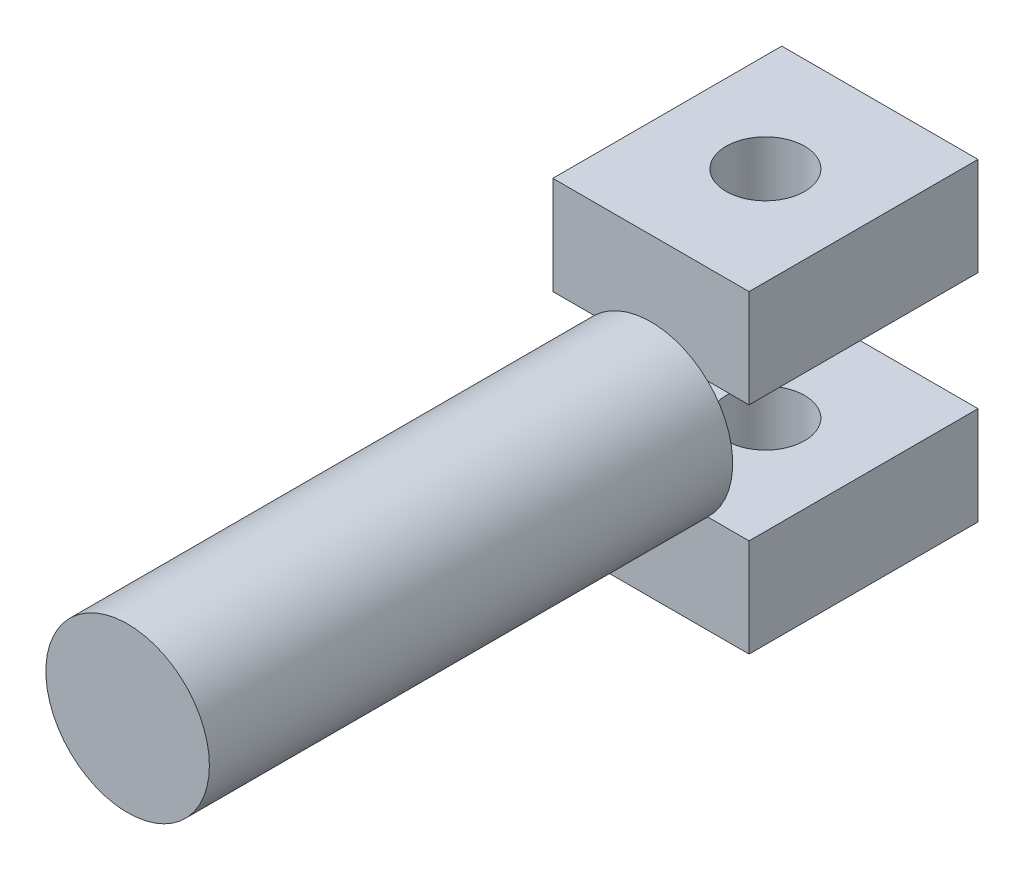
ISO-10303-21;
HEADER;
FILE_DESCRIPTION(('STEP AP214'),'2;1');
FILE_NAME('part.step','',(''),(''),'','','');
FILE_SCHEMA(('AUTOMOTIVE_DESIGN { 1 0 10303 214 1 1 1 1 }'));
ENDSEC;
DATA;
#1=APPLICATION_CONTEXT('core data for automotive mechanical design processes');
#2=APPLICATION_PROTOCOL_DEFINITION('international standard','automotive_design',2000,#1);
#3=PRODUCT_CONTEXT('',#1,'mechanical');
#4=PRODUCT('Part','Part','',(#3));
#5=PRODUCT_RELATED_PRODUCT_CATEGORY('part','',(#4));
#6=PRODUCT_DEFINITION_FORMATION('','',#4);
#7=PRODUCT_DEFINITION_CONTEXT('part definition',#1,'design');
#8=PRODUCT_DEFINITION('design','',#6,#7);
#9=PRODUCT_DEFINITION_SHAPE('','',#8);
#10=(LENGTH_UNIT() NAMED_UNIT(*) SI_UNIT(.MILLI.,.METRE.));
#11=(NAMED_UNIT(*) PLANE_ANGLE_UNIT() SI_UNIT($,.RADIAN.));
#12=(NAMED_UNIT(*) SI_UNIT($,.STERADIAN.) SOLID_ANGLE_UNIT());
#13=UNCERTAINTY_MEASURE_WITH_UNIT(LENGTH_MEASURE(1.E-05),#10,'distance_accuracy_value','');
#14=(GEOMETRIC_REPRESENTATION_CONTEXT(3) GLOBAL_UNCERTAINTY_ASSIGNED_CONTEXT((#13)) GLOBAL_UNIT_ASSIGNED_CONTEXT((#10,
#11,#12)) REPRESENTATION_CONTEXT('',''));
#15=CARTESIAN_POINT('',(0.,0.,0.));
#16=DIRECTION('',(0.,0.,1.));
#17=DIRECTION('',(1.,0.,0.));
#18=AXIS2_PLACEMENT_3D('',#15,#16,#17);
#19=CARTESIAN_POINT('',(-15.,-24.,-35.));
#20=DIRECTION('',(0.,1.,0.));
#21=DIRECTION('',(0.,0.,1.));
#22=AXIS2_PLACEMENT_3D('',#19,#20,#21);
#23=PLANE('',#22);
#24=DIRECTION('',(1.,0.,0.));
#25=VECTOR('',#24,1.);
#26=CARTESIAN_POINT('',(-15.,-24.,-35.));
#27=LINE('',#26,#25);
#28=CARTESIAN_POINT('',(-15.,-24.,-35.));
#29=VERTEX_POINT('',#28);
#30=CARTESIAN_POINT('',(15.,-24.,-35.));
#31=VERTEX_POINT('',#30);
#32=EDGE_CURVE('E281',#29,#31,#27,.T.);
#33=ORIENTED_EDGE('',*,*,#32,.T.);
#34=DIRECTION('',(0.,0.,1.));
#35=VECTOR('',#34,1.);
#36=CARTESIAN_POINT('',(15.,-24.,-35.));
#37=LINE('',#36,#35);
#38=CARTESIAN_POINT('',(15.,-24.,0.));
#39=VERTEX_POINT('',#38);
#40=EDGE_CURVE('E138',#31,#39,#37,.T.);
#41=ORIENTED_EDGE('',*,*,#40,.T.);
#42=DIRECTION('',(1.,0.,0.));
#43=VECTOR('',#42,1.);
#44=CARTESIAN_POINT('',(-15.,-24.,0.));
#45=LINE('',#44,#43);
#46=CARTESIAN_POINT('',(-15.,-24.,0.));
#47=VERTEX_POINT('',#46);
#48=EDGE_CURVE('E130',#47,#39,#45,.T.);
#49=ORIENTED_EDGE('',*,*,#48,.F.);
#50=DIRECTION('',(0.,0.,1.));
#51=VECTOR('',#50,1.);
#52=CARTESIAN_POINT('',(-15.,-24.,-35.));
#53=LINE('',#52,#51);
#54=EDGE_CURVE('E122',#29,#47,#53,.T.);
#55=ORIENTED_EDGE('',*,*,#54,.F.);
#56=EDGE_LOOP('',(#33,#41,#49,#55));
#57=FACE_BOUND('',#56,.T.);
#58=CARTESIAN_POINT('',(0.,-24.000012,-17.5));
#59=DIRECTION('',(0.,-1.,0.));
#60=DIRECTION('',(0.,0.,-1.));
#61=AXIS2_PLACEMENT_3D('',#58,#59,#60);
#62=CIRCLE('',#61,6.);
#63=CARTESIAN_POINT('',(0.,-24.000012,-23.5));
#64=VERTEX_POINT('',#63);
#65=EDGE_CURVE('E150',#64,#64,#62,.T.);
#66=ORIENTED_EDGE('',*,*,#65,.F.);
#67=EDGE_LOOP('',(#66));
#68=FACE_BOUND('',#67,.T.);
#69=ADVANCED_FACE('F44',(#57,#68),#23,.F.);
#70=CARTESIAN_POINT('',(-15.,-24.,0.));
#71=DIRECTION('',(0.,0.,-1.));
#72=DIRECTION('',(-1.,0.,0.));
#73=AXIS2_PLACEMENT_3D('',#70,#71,#72);
#74=PLANE('',#73);
#75=DIRECTION('',(-1.,0.,0.));
#76=VECTOR('',#75,1.);
#77=CARTESIAN_POINT('',(15.,8.99999999999999,0.));
#78=LINE('',#77,#76);
#79=CARTESIAN_POINT('',(15.,8.99999999999999,0.));
#80=VERTEX_POINT('',#79);
#81=CARTESIAN_POINT('',(8.67467578644874,8.99999999999999,0.));
#82=VERTEX_POINT('',#81);
#83=EDGE_CURVE('E111',#80,#82,#78,.T.);
#84=ORIENTED_EDGE('',*,*,#83,.F.);
#85=DIRECTION('',(0.,1.,0.));
#86=VECTOR('',#85,1.);
#87=CARTESIAN_POINT('',(15.,-24.,0.));
#88=LINE('',#87,#86);
#89=CARTESIAN_POINT('',(15.,24.,0.));
#90=VERTEX_POINT('',#89);
#91=EDGE_CURVE('E239',#80,#90,#88,.T.);
#92=ORIENTED_EDGE('',*,*,#91,.T.);
#93=DIRECTION('',(1.,0.,0.));
#94=VECTOR('',#93,1.);
#95=CARTESIAN_POINT('',(-15.,24.,0.));
#96=LINE('',#95,#94);
#97=CARTESIAN_POINT('',(-15.,24.,0.));
#98=VERTEX_POINT('',#97);
#99=EDGE_CURVE('E233',#98,#90,#96,.T.);
#100=ORIENTED_EDGE('',*,*,#99,.F.);
#101=DIRECTION('',(0.,1.,0.));
#102=VECTOR('',#101,1.);
#103=CARTESIAN_POINT('',(-15.,0.,0.));
#104=LINE('',#103,#102);
#105=CARTESIAN_POINT('',(-15.,8.99999999999999,0.));
#106=VERTEX_POINT('',#105);
#107=EDGE_CURVE('E136',#106,#98,#104,.T.);
#108=ORIENTED_EDGE('',*,*,#107,.F.);
#109=CARTESIAN_POINT('',(-8.67467578644874,8.99999999999999,0.));
#110=VERTEX_POINT('',#109);
#111=EDGE_CURVE('E87',#110,#106,#78,.T.);
#112=ORIENTED_EDGE('',*,*,#111,.F.);
#113=CARTESIAN_POINT('',(0.,0.,0.));
#114=DIRECTION('',(0.,0.,1.));
#115=DIRECTION('',(1.,0.,0.));
#116=AXIS2_PLACEMENT_3D('',#113,#114,#115);
#117=CIRCLE('',#116,12.5);
#118=EDGE_CURVE('E59',#82,#110,#117,.T.);
#119=ORIENTED_EDGE('',*,*,#118,.F.);
#120=EDGE_LOOP('',(#84,#92,#100,#108,#112,#119));
#121=FACE_BOUND('',#120,.T.);
#122=ADVANCED_FACE('F193',(#121),#74,.F.);
#123=CARTESIAN_POINT('',(-15.,-24.,-35.));
#124=DIRECTION('',(0.,0.,1.));
#125=DIRECTION('',(1.,0.,0.));
#126=AXIS2_PLACEMENT_3D('',#123,#124,#125);
#127=PLANE('',#126);
#128=DIRECTION('',(-1.,0.,0.));
#129=VECTOR('',#128,1.);
#130=CARTESIAN_POINT('',(15.,-9.,-35.));
#131=LINE('',#130,#129);
#132=CARTESIAN_POINT('',(15.,-9.,-35.));
#133=VERTEX_POINT('',#132);
#134=CARTESIAN_POINT('',(-15.,-9.,-35.));
#135=VERTEX_POINT('',#134);
#136=EDGE_CURVE('E67',#133,#135,#131,.T.);
#137=ORIENTED_EDGE('',*,*,#136,.F.);
#138=DIRECTION('',(0.,-1.,0.));
#139=VECTOR('',#138,1.);
#140=CARTESIAN_POINT('',(15.,-24.,-35.));
#141=LINE('',#140,#139);
#142=EDGE_CURVE('E269',#133,#31,#141,.T.);
#143=ORIENTED_EDGE('',*,*,#142,.T.);
#144=ORIENTED_EDGE('',*,*,#32,.F.);
#145=DIRECTION('',(0.,1.,0.));
#146=VECTOR('',#145,1.);
#147=CARTESIAN_POINT('',(-15.,0.,-35.));
#148=LINE('',#147,#146);
#149=EDGE_CURVE('E124',#135,#29,#148,.F.);
#150=ORIENTED_EDGE('',*,*,#149,.F.);
#151=EDGE_LOOP('',(#137,#143,#144,#150));
#152=FACE_BOUND('',#151,.T.);
#153=ADVANCED_FACE('F188',(#152),#127,.F.);
#154=CARTESIAN_POINT('',(-15.,0.,0.));
#155=DIRECTION('',(1.,0.,0.));
#156=DIRECTION('',(0.,0.,-1.));
#157=AXIS2_PLACEMENT_3D('',#154,#155,#156);
#158=PLANE('',#157);
#159=DIRECTION('',(0.,0.,-1.));
#160=VECTOR('',#159,1.);
#161=CARTESIAN_POINT('',(-15.,8.99999999999999,0.));
#162=LINE('',#161,#160);
#163=CARTESIAN_POINT('',(-15.,9.,-35.));
#164=VERTEX_POINT('',#163);
#165=EDGE_CURVE('E89',#106,#164,#162,.T.);
#166=ORIENTED_EDGE('',*,*,#165,.F.);
#167=ORIENTED_EDGE('',*,*,#107,.T.);
#168=DIRECTION('',(0.,0.,-1.));
#169=VECTOR('',#168,1.);
#170=CARTESIAN_POINT('',(-15.,24.,-35.));
#171=LINE('',#170,#169);
#172=CARTESIAN_POINT('',(-15.,24.,-35.));
#173=VERTEX_POINT('',#172);
#174=EDGE_CURVE('E116',#98,#173,#171,.T.);
#175=ORIENTED_EDGE('',*,*,#174,.T.);
#176=DIRECTION('',(0.,1.,0.));
#177=VECTOR('',#176,1.);
#178=CARTESIAN_POINT('',(-15.,0.,-35.));
#179=LINE('',#178,#177);
#180=EDGE_CURVE('E109',#173,#164,#179,.F.);
#181=ORIENTED_EDGE('',*,*,#180,.T.);
#182=EDGE_LOOP('',(#166,#167,#175,#181));
#183=FACE_BOUND('',#182,.T.);
#184=ADVANCED_FACE('F120',(#183),#158,.F.);
#185=DIRECTION('',(0.,0.,1.));
#186=VECTOR('',#185,1.);
#187=CARTESIAN_POINT('',(-15.,-8.99999999999999,0.));
#188=LINE('',#187,#186);
#189=CARTESIAN_POINT('',(-15.,-8.99999999999999,0.));
#190=VERTEX_POINT('',#189);
#191=EDGE_CURVE('E105',#135,#190,#188,.T.);
#192=ORIENTED_EDGE('',*,*,#191,.F.);
#193=ORIENTED_EDGE('',*,*,#149,.T.);
#194=ORIENTED_EDGE('',*,*,#54,.T.);
#195=DIRECTION('',(0.,1.,0.));
#196=VECTOR('',#195,1.);
#197=CARTESIAN_POINT('',(-15.,0.,0.));
#198=LINE('',#197,#196);
#199=EDGE_CURVE('E135',#47,#190,#198,.T.);
#200=ORIENTED_EDGE('',*,*,#199,.T.);
#201=EDGE_LOOP('',(#192,#193,#194,#200));
#202=FACE_BOUND('',#201,.T.);
#203=ADVANCED_FACE('F190',(#202),#158,.F.);
#204=CARTESIAN_POINT('',(15.,0.,0.));
#205=DIRECTION('',(1.,0.,0.));
#206=DIRECTION('',(0.,0.,-1.));
#207=AXIS2_PLACEMENT_3D('',#204,#205,#206);
#208=PLANE('',#207);
#209=ORIENTED_EDGE('',*,*,#142,.F.);
#210=DIRECTION('',(0.,0.,1.));
#211=VECTOR('',#210,1.);
#212=CARTESIAN_POINT('',(15.,-8.99999999999999,0.));
#213=LINE('',#212,#211);
#214=CARTESIAN_POINT('',(15.,-8.99999999999999,0.));
#215=VERTEX_POINT('',#214);
#216=EDGE_CURVE('E252',#133,#215,#213,.T.);
#217=ORIENTED_EDGE('',*,*,#216,.T.);
#218=EDGE_CURVE('E263',#39,#215,#88,.T.);
#219=ORIENTED_EDGE('',*,*,#218,.F.);
#220=ORIENTED_EDGE('',*,*,#40,.F.);
#221=EDGE_LOOP('',(#209,#217,#219,#220));
#222=FACE_BOUND('',#221,.T.);
#223=ADVANCED_FACE('F181',(#222),#208,.T.);
#224=ORIENTED_EDGE('',*,*,#91,.F.);
#225=DIRECTION('',(0.,0.,-1.));
#226=VECTOR('',#225,1.);
#227=CARTESIAN_POINT('',(15.,8.99999999999999,0.));
#228=LINE('',#227,#226);
#229=CARTESIAN_POINT('',(15.,9.,-35.));
#230=VERTEX_POINT('',#229);
#231=EDGE_CURVE('E314',#80,#230,#228,.T.);
#232=ORIENTED_EDGE('',*,*,#231,.T.);
#233=CARTESIAN_POINT('',(15.,24.,-35.));
#234=VERTEX_POINT('',#233);
#235=EDGE_CURVE('E115',#234,#230,#141,.T.);
#236=ORIENTED_EDGE('',*,*,#235,.F.);
#237=DIRECTION('',(0.,0.,-1.));
#238=VECTOR('',#237,1.);
#239=CARTESIAN_POINT('',(15.,24.,-35.));
#240=LINE('',#239,#238);
#241=EDGE_CURVE('E266',#90,#234,#240,.T.);
#242=ORIENTED_EDGE('',*,*,#241,.F.);
#243=EDGE_LOOP('',(#224,#232,#236,#242));
#244=FACE_BOUND('',#243,.T.);
#245=ADVANCED_FACE('F187',(#244),#208,.T.);
#246=CARTESIAN_POINT('',(0.,0.,80.));
#247=DIRECTION('',(0.,0.,-1.));
#248=DIRECTION('',(-1.,0.,0.));
#249=AXIS2_PLACEMENT_3D('',#246,#247,#248);
#250=CYLINDRICAL_SURFACE('',#249,12.5);
#251=CARTESIAN_POINT('',(0.,0.,80.));
#252=DIRECTION('',(0.,0.,1.));
#253=DIRECTION('',(1.,0.,0.));
#254=AXIS2_PLACEMENT_3D('',#251,#252,#253);
#255=CIRCLE('',#254,12.5);
#256=CARTESIAN_POINT('',(12.5,0.,80.));
#257=VERTEX_POINT('',#256);
#258=EDGE_CURVE('E11',#257,#257,#255,.T.);
#259=ORIENTED_EDGE('',*,*,#258,.F.);
#260=EDGE_LOOP('',(#259));
#261=FACE_BOUND('',#260,.T.);
#262=ORIENTED_EDGE('',*,*,#118,.T.);
#263=CARTESIAN_POINT('',(-8.67467578644874,-8.99999999999999,0.));
#264=VERTEX_POINT('',#263);
#265=EDGE_CURVE('E225',#110,#264,#117,.T.);
#266=ORIENTED_EDGE('',*,*,#265,.T.);
#267=CARTESIAN_POINT('',(8.67467578644874,-8.99999999999999,0.));
#268=VERTEX_POINT('',#267);
#269=EDGE_CURVE('E231',#264,#268,#117,.T.);
#270=ORIENTED_EDGE('',*,*,#269,.T.);
#271=EDGE_CURVE('E223',#268,#82,#117,.T.);
#272=ORIENTED_EDGE('',*,*,#271,.T.);
#273=EDGE_LOOP('',(#262,#266,#270,#272));
#274=FACE_BOUND('',#273,.T.);
#275=ADVANCED_FACE('F50',(#261,#274),#250,.T.);
#276=CARTESIAN_POINT('',(0.,0.,80.));
#277=DIRECTION('',(0.,0.,1.));
#278=DIRECTION('',(1.,0.,0.));
#279=AXIS2_PLACEMENT_3D('',#276,#277,#278);
#280=PLANE('',#279);
#281=ORIENTED_EDGE('',*,*,#258,.T.);
#282=EDGE_LOOP('',(#281));
#283=FACE_BOUND('',#282,.T.);
#284=ADVANCED_FACE('F201',(#283),#280,.T.);
#285=ORIENTED_EDGE('',*,*,#218,.T.);
#286=DIRECTION('',(-1.,0.,0.));
#287=VECTOR('',#286,1.);
#288=CARTESIAN_POINT('',(15.,-8.99999999999999,0.));
#289=LINE('',#288,#287);
#290=EDGE_CURVE('E237',#215,#268,#289,.T.);
#291=ORIENTED_EDGE('',*,*,#290,.T.);
#292=ORIENTED_EDGE('',*,*,#269,.F.);
#293=EDGE_CURVE('E249',#264,#190,#289,.T.);
#294=ORIENTED_EDGE('',*,*,#293,.T.);
#295=ORIENTED_EDGE('',*,*,#199,.F.);
#296=ORIENTED_EDGE('',*,*,#48,.T.);
#297=EDGE_LOOP('',(#285,#291,#292,#294,#295,#296));
#298=FACE_BOUND('',#297,.T.);
#299=ADVANCED_FACE('F203',(#298),#74,.F.);
#300=CARTESIAN_POINT('',(-15.,24.,-35.));
#301=DIRECTION('',(0.,-1.,0.));
#302=DIRECTION('',(0.,0.,-1.));
#303=AXIS2_PLACEMENT_3D('',#300,#301,#302);
#304=PLANE('',#303);
#305=CARTESIAN_POINT('',(0.,24.,-17.5));
#306=DIRECTION('',(0.,-1.,0.));
#307=DIRECTION('',(0.,0.,-1.));
#308=AXIS2_PLACEMENT_3D('',#305,#306,#307);
#309=CIRCLE('',#308,6.);
#310=CARTESIAN_POINT('',(0.,24.,-23.5));
#311=VERTEX_POINT('',#310);
#312=EDGE_CURVE('E141',#311,#311,#309,.T.);
#313=ORIENTED_EDGE('',*,*,#312,.T.);
#314=EDGE_LOOP('',(#313));
#315=FACE_BOUND('',#314,.T.);
#316=ORIENTED_EDGE('',*,*,#99,.T.);
#317=ORIENTED_EDGE('',*,*,#241,.T.);
#318=DIRECTION('',(1.,0.,0.));
#319=VECTOR('',#318,1.);
#320=CARTESIAN_POINT('',(-15.,24.,-35.));
#321=LINE('',#320,#319);
#322=EDGE_CURVE('E301',#173,#234,#321,.T.);
#323=ORIENTED_EDGE('',*,*,#322,.F.);
#324=ORIENTED_EDGE('',*,*,#174,.F.);
#325=EDGE_LOOP('',(#316,#317,#323,#324));
#326=FACE_BOUND('',#325,.T.);
#327=ADVANCED_FACE('F196',(#315,#326),#304,.F.);
#328=ORIENTED_EDGE('',*,*,#235,.T.);
#329=DIRECTION('',(-1.,0.,0.));
#330=VECTOR('',#329,1.);
#331=CARTESIAN_POINT('',(15.,9.,-35.));
#332=LINE('',#331,#330);
#333=EDGE_CURVE('E92',#230,#164,#332,.T.);
#334=ORIENTED_EDGE('',*,*,#333,.T.);
#335=ORIENTED_EDGE('',*,*,#180,.F.);
#336=ORIENTED_EDGE('',*,*,#322,.T.);
#337=EDGE_LOOP('',(#328,#334,#335,#336));
#338=FACE_BOUND('',#337,.T.);
#339=ADVANCED_FACE('F107',(#338),#127,.F.);
#340=CARTESIAN_POINT('',(15.,8.99999999999999,0.));
#341=DIRECTION('',(0.,0.,1.));
#342=DIRECTION('',(1.,0.,0.));
#343=AXIS2_PLACEMENT_3D('',#340,#341,#342);
#344=PLANE('',#343);
#345=EDGE_CURVE('E261',#82,#110,#78,.T.);
#346=ORIENTED_EDGE('',*,*,#345,.F.);
#347=ORIENTED_EDGE('',*,*,#271,.F.);
#348=EDGE_CURVE('E242',#268,#264,#289,.T.);
#349=ORIENTED_EDGE('',*,*,#348,.T.);
#350=ORIENTED_EDGE('',*,*,#265,.F.);
#351=EDGE_LOOP('',(#346,#347,#349,#350));
#352=FACE_BOUND('',#351,.T.);
#353=ADVANCED_FACE('F173',(#352),#344,.F.);
#354=CARTESIAN_POINT('',(15.,-8.99999999999999,0.));
#355=DIRECTION('',(0.,-1.,0.));
#356=DIRECTION('',(0.,0.,-1.));
#357=AXIS2_PLACEMENT_3D('',#354,#355,#356);
#358=PLANE('',#357);
#359=CARTESIAN_POINT('',(0.,-8.99999999999999,-17.5));
#360=DIRECTION('',(0.,-1.,0.));
#361=DIRECTION('',(0.,0.,-1.));
#362=AXIS2_PLACEMENT_3D('',#359,#360,#361);
#363=CIRCLE('',#362,6.);
#364=CARTESIAN_POINT('',(0.,-9.,-23.5));
#365=VERTEX_POINT('',#364);
#366=EDGE_CURVE('E103',#365,#365,#363,.T.);
#367=ORIENTED_EDGE('',*,*,#366,.T.);
#368=EDGE_LOOP('',(#367));
#369=FACE_BOUND('',#368,.T.);
#370=ORIENTED_EDGE('',*,*,#290,.F.);
#371=ORIENTED_EDGE('',*,*,#216,.F.);
#372=ORIENTED_EDGE('',*,*,#136,.T.);
#373=ORIENTED_EDGE('',*,*,#191,.T.);
#374=ORIENTED_EDGE('',*,*,#293,.F.);
#375=ORIENTED_EDGE('',*,*,#348,.F.);
#376=EDGE_LOOP('',(#370,#371,#372,#373,#374,#375));
#377=FACE_BOUND('',#376,.T.);
#378=ADVANCED_FACE('F175',(#369,#377),#358,.F.);
#379=CARTESIAN_POINT('',(15.,8.99999999999999,0.));
#380=DIRECTION('',(0.,1.,0.));
#381=DIRECTION('',(0.,0.,1.));
#382=AXIS2_PLACEMENT_3D('',#379,#380,#381);
#383=PLANE('',#382);
#384=CARTESIAN_POINT('',(0.,9.,-17.5));
#385=DIRECTION('',(0.,1.,0.));
#386=DIRECTION('',(0.,0.,1.));
#387=AXIS2_PLACEMENT_3D('',#384,#385,#386);
#388=CIRCLE('',#387,6.);
#389=CARTESIAN_POINT('',(0.,9.,-11.5));
#390=VERTEX_POINT('',#389);
#391=EDGE_CURVE('E140',#390,#390,#388,.T.);
#392=ORIENTED_EDGE('',*,*,#391,.T.);
#393=EDGE_LOOP('',(#392));
#394=FACE_BOUND('',#393,.T.);
#395=ORIENTED_EDGE('',*,*,#333,.F.);
#396=ORIENTED_EDGE('',*,*,#231,.F.);
#397=ORIENTED_EDGE('',*,*,#83,.T.);
#398=ORIENTED_EDGE('',*,*,#345,.T.);
#399=ORIENTED_EDGE('',*,*,#111,.T.);
#400=ORIENTED_EDGE('',*,*,#165,.T.);
#401=EDGE_LOOP('',(#395,#396,#397,#398,#399,#400));
#402=FACE_BOUND('',#401,.T.);
#403=ADVANCED_FACE('F95',(#394,#402),#383,.F.);
#404=CARTESIAN_POINT('',(0.,24.,-17.5));
#405=DIRECTION('',(0.,-1.,0.));
#406=DIRECTION('',(0.,0.,-1.));
#407=AXIS2_PLACEMENT_3D('',#404,#405,#406);
#408=CYLINDRICAL_SURFACE('',#407,6.);
#409=ORIENTED_EDGE('',*,*,#312,.F.);
#410=EDGE_LOOP('',(#409));
#411=FACE_BOUND('',#410,.T.);
#412=ORIENTED_EDGE('',*,*,#391,.F.);
#413=EDGE_LOOP('',(#412));
#414=FACE_BOUND('',#413,.T.);
#415=ADVANCED_FACE('F172',(#411,#414),#408,.F.);
#416=ORIENTED_EDGE('',*,*,#65,.T.);
#417=EDGE_LOOP('',(#416));
#418=FACE_BOUND('',#417,.T.);
#419=ORIENTED_EDGE('',*,*,#366,.F.);
#420=EDGE_LOOP('',(#419));
#421=FACE_BOUND('',#420,.T.);
#422=ADVANCED_FACE('F165',(#418,#421),#408,.F.);
#423=CLOSED_SHELL('',(#69,#122,#153,#184,#203,#223,#245,#275,#284,#299,#327,#339,#353,#378,#403,
#415,#422));
#424=MANIFOLD_SOLID_BREP('B2',#423);
#425=ADVANCED_BREP_SHAPE_REPRESENTATION('',(#18,#424),#14);
#426=SHAPE_DEFINITION_REPRESENTATION(#9,#425);
ENDSEC;
END-ISO-10303-21;
